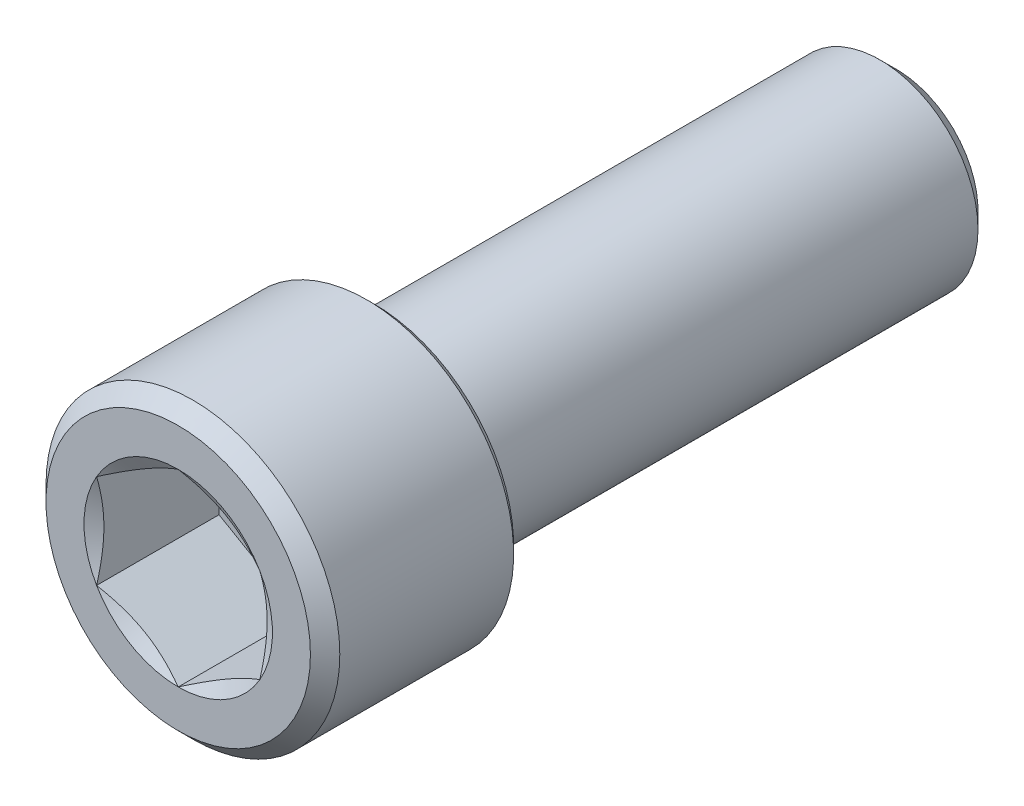
ISO-10303-21;
HEADER;
FILE_DESCRIPTION(('STEP AP214'),'2;1');
FILE_NAME('part.step','',(''),(''),'','','');
FILE_SCHEMA(('AUTOMOTIVE_DESIGN { 1 0 10303 214 1 1 1 1 }'));
ENDSEC;
DATA;
#1=APPLICATION_CONTEXT('core data for automotive mechanical design processes');
#2=APPLICATION_PROTOCOL_DEFINITION('international standard','automotive_design',2000,#1);
#3=PRODUCT_CONTEXT('',#1,'mechanical');
#4=PRODUCT('Part','Part','',(#3));
#5=PRODUCT_RELATED_PRODUCT_CATEGORY('part','',(#4));
#6=PRODUCT_DEFINITION_FORMATION('','',#4);
#7=PRODUCT_DEFINITION_CONTEXT('part definition',#1,'design');
#8=PRODUCT_DEFINITION('design','',#6,#7);
#9=PRODUCT_DEFINITION_SHAPE('','',#8);
#10=(LENGTH_UNIT() NAMED_UNIT(*) SI_UNIT(.MILLI.,.METRE.));
#11=(NAMED_UNIT(*) PLANE_ANGLE_UNIT() SI_UNIT($,.RADIAN.));
#12=(NAMED_UNIT(*) SI_UNIT($,.STERADIAN.) SOLID_ANGLE_UNIT());
#13=UNCERTAINTY_MEASURE_WITH_UNIT(LENGTH_MEASURE(1.E-05),#10,'distance_accuracy_value','');
#14=(GEOMETRIC_REPRESENTATION_CONTEXT(3) GLOBAL_UNCERTAINTY_ASSIGNED_CONTEXT((#13)) GLOBAL_UNIT_ASSIGNED_CONTEXT((#10,
#11,#12)) REPRESENTATION_CONTEXT('',''));
#15=CARTESIAN_POINT('',(0.,0.,0.));
#16=DIRECTION('',(0.,0.,1.));
#17=DIRECTION('',(1.,0.,0.));
#18=AXIS2_PLACEMENT_3D('',#15,#16,#17);
#19=CARTESIAN_POINT('',(0.,7.14375,17.4625));
#20=DIRECTION('',(0.,0.,1.));
#21=DIRECTION('',(1.,0.,0.));
#22=AXIS2_PLACEMENT_3D('',#19,#20,#21);
#23=PLANE('',#22);
#24=CARTESIAN_POINT('',(0.,0.,17.4625));
#25=DIRECTION('',(0.,0.,1.));
#26=DIRECTION('',(1.,0.,0.));
#27=AXIS2_PLACEMENT_3D('',#24,#25,#26);
#28=CIRCLE('',#27,6.429375);
#29=CARTESIAN_POINT('',(6.429375,0.,17.4625));
#30=VERTEX_POINT('',#29);
#31=EDGE_CURVE('E172',#30,#30,#28,.T.);
#32=ORIENTED_EDGE('',*,*,#31,.T.);
#33=EDGE_LOOP('',(#32));
#34=FACE_BOUND('',#33,.T.);
#35=CARTESIAN_POINT('',(0.,0.,17.4625));
#36=DIRECTION('',(0.,0.,1.));
#37=DIRECTION('',(1.,0.,0.));
#38=AXIS2_PLACEMENT_3D('',#35,#36,#37);
#39=CIRCLE('',#38,4.58271776169265);
#40=CARTESIAN_POINT('',(3.96875,2.29135888084632,17.4625));
#41=VERTEX_POINT('',#40);
#42=CARTESIAN_POINT('',(0.,4.58271776169265,17.4625));
#43=VERTEX_POINT('',#42);
#44=EDGE_CURVE('E90',#41,#43,#39,.T.);
#45=ORIENTED_EDGE('',*,*,#44,.F.);
#46=CARTESIAN_POINT('',(3.96875,-2.29135888084633,17.4625));
#47=VERTEX_POINT('',#46);
#48=EDGE_CURVE('E50',#47,#41,#39,.T.);
#49=ORIENTED_EDGE('',*,*,#48,.F.);
#50=CARTESIAN_POINT('',(0.,-4.58271776169266,17.4625));
#51=VERTEX_POINT('',#50);
#52=EDGE_CURVE('E277',#51,#47,#39,.T.);
#53=ORIENTED_EDGE('',*,*,#52,.F.);
#54=CARTESIAN_POINT('',(-3.96875,-2.29135888084633,17.4625));
#55=VERTEX_POINT('',#54);
#56=EDGE_CURVE('E57',#55,#51,#39,.T.);
#57=ORIENTED_EDGE('',*,*,#56,.F.);
#58=CARTESIAN_POINT('',(-3.96875,2.29135888084632,17.4625));
#59=VERTEX_POINT('',#58);
#60=EDGE_CURVE('E130',#59,#55,#39,.T.);
#61=ORIENTED_EDGE('',*,*,#60,.F.);
#62=EDGE_CURVE('E99',#43,#59,#39,.T.);
#63=ORIENTED_EDGE('',*,*,#62,.F.);
#64=EDGE_LOOP('',(#45,#49,#53,#57,#61,#63));
#65=FACE_BOUND('',#64,.T.);
#66=ADVANCED_FACE('F36',(#34,#65),#23,.T.);
#67=CARTESIAN_POINT('',(0.,0.,-17.4625));
#68=DIRECTION('',(0.,0.,-1.));
#69=DIRECTION('',(-1.,0.,0.));
#70=AXIS2_PLACEMENT_3D('',#67,#68,#69);
#71=CYLINDRICAL_SURFACE('',#70,7.14375);
#72=CARTESIAN_POINT('',(0.,0.,8.29468749999999));
#73=DIRECTION('',(0.,0.,-1.));
#74=DIRECTION('',(-1.,0.,0.));
#75=AXIS2_PLACEMENT_3D('',#72,#73,#74);
#76=CIRCLE('',#75,7.14375);
#77=CARTESIAN_POINT('',(-7.14375,0.,8.29468749999999));
#78=VERTEX_POINT('',#77);
#79=EDGE_CURVE('E11',#78,#78,#76,.F.);
#80=ORIENTED_EDGE('',*,*,#79,.T.);
#81=EDGE_LOOP('',(#80));
#82=FACE_BOUND('',#81,.T.);
#83=CARTESIAN_POINT('',(0.,0.,16.748125));
#84=DIRECTION('',(0.,0.,1.));
#85=DIRECTION('',(1.,0.,0.));
#86=AXIS2_PLACEMENT_3D('',#83,#84,#85);
#87=CIRCLE('',#86,7.14375);
#88=CARTESIAN_POINT('',(7.14375,0.,16.748125));
#89=VERTEX_POINT('',#88);
#90=EDGE_CURVE('E109',#89,#89,#87,.F.);
#91=ORIENTED_EDGE('',*,*,#90,.T.);
#92=EDGE_LOOP('',(#91));
#93=FACE_BOUND('',#92,.T.);
#94=ADVANCED_FACE('F189',(#82,#93),#71,.T.);
#95=CARTESIAN_POINT('',(0.,7.14375,7.9375));
#96=DIRECTION('',(0.,0.,-1.));
#97=DIRECTION('',(-1.,0.,0.));
#98=AXIS2_PLACEMENT_3D('',#95,#96,#97);
#99=PLANE('',#98);
#100=CARTESIAN_POINT('',(0.,0.,7.9375));
#101=DIRECTION('',(0.,0.,-1.));
#102=DIRECTION('',(-1.,0.,0.));
#103=AXIS2_PLACEMENT_3D('',#100,#101,#102);
#104=CIRCLE('',#103,6.7865625);
#105=CARTESIAN_POINT('',(-6.7865625,0.,7.9375));
#106=VERTEX_POINT('',#105);
#107=EDGE_CURVE('E44',#106,#106,#104,.T.);
#108=ORIENTED_EDGE('',*,*,#107,.T.);
#109=EDGE_LOOP('',(#108));
#110=FACE_BOUND('',#109,.T.);
#111=CARTESIAN_POINT('',(0.,0.,7.9375));
#112=DIRECTION('',(0.,0.,-1.));
#113=DIRECTION('',(-1.,0.,0.));
#114=AXIS2_PLACEMENT_3D('',#111,#112,#113);
#115=CIRCLE('',#114,4.7625);
#116=CARTESIAN_POINT('',(-4.7625,0.,7.9375));
#117=VERTEX_POINT('',#116);
#118=EDGE_CURVE('E110',#117,#117,#115,.T.);
#119=ORIENTED_EDGE('',*,*,#118,.F.);
#120=EDGE_LOOP('',(#119));
#121=FACE_BOUND('',#120,.T.);
#122=ADVANCED_FACE('F177',(#110,#121),#99,.T.);
#123=CARTESIAN_POINT('',(0.,0.,-17.4625));
#124=DIRECTION('',(0.,0.,-1.));
#125=DIRECTION('',(-1.,0.,0.));
#126=AXIS2_PLACEMENT_3D('',#123,#124,#125);
#127=CYLINDRICAL_SURFACE('',#126,4.7625);
#128=ORIENTED_EDGE('',*,*,#118,.T.);
#129=EDGE_LOOP('',(#128));
#130=FACE_BOUND('',#129,.T.);
#131=CARTESIAN_POINT('',(0.,0.,-16.6687499999936));
#132=DIRECTION('',(0.,0.,-1.));
#133=DIRECTION('',(-1.,0.,0.));
#134=AXIS2_PLACEMENT_3D('',#131,#132,#133);
#135=CIRCLE('',#134,4.7625);
#136=CARTESIAN_POINT('',(-4.7625,0.,-16.6687499999936));
#137=VERTEX_POINT('',#136);
#138=EDGE_CURVE('E218',#137,#137,#135,.T.);
#139=ORIENTED_EDGE('',*,*,#138,.F.);
#140=EDGE_LOOP('',(#139));
#141=FACE_BOUND('',#140,.T.);
#142=ADVANCED_FACE('F200',(#130,#141),#127,.T.);
#143=CARTESIAN_POINT('',(0.,0.,-17.4625));
#144=DIRECTION('',(0.,0.,1.));
#145=DIRECTION('',(1.,0.,0.));
#146=AXIS2_PLACEMENT_3D('',#143,#144,#145);
#147=CONICAL_SURFACE('',#146,3.96874999999365,0.785398163397443);
#148=ORIENTED_EDGE('',*,*,#138,.T.);
#149=EDGE_LOOP('',(#148));
#150=FACE_BOUND('',#149,.T.);
#151=CARTESIAN_POINT('',(0.,0.,-17.4625));
#152=DIRECTION('',(0.,0.,-1.));
#153=DIRECTION('',(-1.,0.,0.));
#154=AXIS2_PLACEMENT_3D('',#151,#152,#153);
#155=CIRCLE('',#154,3.96874999999365);
#156=CARTESIAN_POINT('',(-3.96874999999365,0.,-17.4625));
#157=VERTEX_POINT('',#156);
#158=EDGE_CURVE('E216',#157,#157,#155,.T.);
#159=ORIENTED_EDGE('',*,*,#158,.F.);
#160=EDGE_LOOP('',(#159));
#161=FACE_BOUND('',#160,.T.);
#162=ADVANCED_FACE('F203',(#150,#161),#147,.T.);
#163=CARTESIAN_POINT('',(0.,3.96874999999365,-17.4625));
#164=DIRECTION('',(0.,0.,-1.));
#165=DIRECTION('',(-1.,0.,0.));
#166=AXIS2_PLACEMENT_3D('',#163,#164,#165);
#167=PLANE('',#166);
#168=ORIENTED_EDGE('',*,*,#158,.T.);
#169=EDGE_LOOP('',(#168));
#170=FACE_BOUND('',#169,.T.);
#171=ADVANCED_FACE('F206',(#170),#167,.T.);
#172=CARTESIAN_POINT('',(0.,0.,17.4625));
#173=DIRECTION('',(0.,0.,1.));
#174=DIRECTION('',(1.,0.,0.));
#175=AXIS2_PLACEMENT_3D('',#172,#173,#174);
#176=CONICAL_SURFACE('',#175,4.58271776169265,1.0471975511966);
#177=ORIENTED_EDGE('',*,*,#62,.T.);
#178=CARTESIAN_POINT('',(0.000199999999998701,4.58283323174649,17.4625666691863));
#179=CARTESIAN_POINT('',(-0.174205902081157,4.48213993723167,17.4044101658675));
#180=CARTESIAN_POINT('',(-0.350117265982851,4.38057746392952,17.3515190334947));
#181=CARTESIAN_POINT('',(-0.704986056512739,4.17569387219009,17.2591972310558));
#182=CARTESIAN_POINT('',(-0.883949788458083,4.07236911337626,17.2197992206996));
#183=CARTESIAN_POINT('',(-1.23965934318176,3.86700010620323,17.1584707510344));
#184=CARTESIAN_POINT('',(-1.41635043707328,3.76498745558155,17.1361321137042));
#185=CARTESIAN_POINT('',(-1.7705639777928,3.56048217249652,17.1094648900063));
#186=CARTESIAN_POINT('',(-1.94808513722976,3.45799028330874,17.1051142203823));
#187=CARTESIAN_POINT('',(-2.27979074080338,3.2664799637938,17.1141671972599));
#188=CARTESIAN_POINT('',(-2.43402485076552,3.17743285888894,17.1253480315052));
#189=CARTESIAN_POINT('',(-2.74148824092523,2.99991878781428,17.1607840680674));
#190=CARTESIAN_POINT('',(-2.89471645773984,2.91145243558892,17.1850513743229));
#191=CARTESIAN_POINT('',(-3.20281373181354,2.73357239146588,17.2457175088671));
#192=CARTESIAN_POINT('',(-3.3576437962636,2.64418121207698,17.2823734880916));
#193=CARTESIAN_POINT('',(-3.66499472649982,2.46673206976942,17.3655680488882));
#194=CARTESIAN_POINT('',(-3.81751952962953,2.37867183362439,17.412087083746));
#195=CARTESIAN_POINT('',(-3.96895,2.29124341079249,17.4625666691863));
#196=B_SPLINE_CURVE_WITH_KNOTS('',3,(#178,#179,#180,#181,#182,#183,#184,#185,#186,#187,#188,
#189,#190,#191,#192,#193,#194,#195),.UNSPECIFIED.,.F.,.F.,(4,2,2,2,2,2,2,2,4),(0.,
0.629094460519772,1.25970103886327,1.87470051579827,2.48894475282133,3.02377031984306,
3.55909140824994,4.1062865060967,4.65240713705191),.UNSPECIFIED.);
#197=EDGE_CURVE('E104',#43,#59,#196,.T.);
#198=ORIENTED_EDGE('',*,*,#197,.F.);
#199=EDGE_LOOP('',(#177,#198));
#200=FACE_BOUND('',#199,.T.);
#201=ADVANCED_FACE('F105',(#200),#176,.F.);
#202=ORIENTED_EDGE('',*,*,#60,.T.);
#203=CARTESIAN_POINT('',(-3.96875,-5.93385720069013,18.9382213021848));
#204=CARTESIAN_POINT('',(-3.96875,-5.76247290518236,18.8559976024317));
#205=CARTESIAN_POINT('',(-3.96875,-5.59067109411654,18.7746279437628));
#206=CARTESIAN_POINT('',(-3.96875,-5.24600992189622,18.6140811944775));
#207=CARTESIAN_POINT('',(-3.96875,-5.07315037719824,18.534904498373));
#208=CARTESIAN_POINT('',(-3.96875,-4.72516008066855,18.378785832207));
#209=CARTESIAN_POINT('',(-3.96875,-4.55002191228936,18.3018603315239));
#210=CARTESIAN_POINT('',(-3.96875,-4.19827592516792,18.1514588596294));
#211=CARTESIAN_POINT('',(-3.96875,-4.02166818335657,18.0779827091684));
#212=CARTESIAN_POINT('',(-3.96875,-3.66204995795869,17.9335274579091));
#213=CARTESIAN_POINT('',(-3.96875,-3.47899279883904,17.8626638723423));
#214=CARTESIAN_POINT('',(-3.96875,-3.11066428213307,17.7268283656521));
#215=CARTESIAN_POINT('',(-3.96875,-2.92539267073644,17.6618571273551));
#216=CARTESIAN_POINT('',(-3.96875,-2.55276020400712,17.5396615785013));
#217=CARTESIAN_POINT('',(-3.96875,-2.36540517915988,17.4824196795427));
#218=CARTESIAN_POINT('',(-3.96875,-1.98802653725316,17.377648579222));
#219=CARTESIAN_POINT('',(-3.96875,-1.79800384013078,17.3301161134531));
#220=CARTESIAN_POINT('',(-3.96875,-1.41566112805396,17.2472893763848));
#221=CARTESIAN_POINT('',(-3.96875,-1.2233465491972,17.2119704987359));
#222=CARTESIAN_POINT('',(-3.96875,-0.836565803633968,17.155886574413));
#223=CARTESIAN_POINT('',(-3.96875,-0.642099783228199,17.1351205442315));
#224=CARTESIAN_POINT('',(-3.96875,-0.254422907076688,17.11006899599));
#225=CARTESIAN_POINT('',(-3.96875,-0.0612249296201029,17.105588996765));
#226=CARTESIAN_POINT('',(-3.96875,0.324869034019207,17.1129893123645));
#227=CARTESIAN_POINT('',(-3.96875,0.517765000762246,17.1248706402193));
#228=CARTESIAN_POINT('',(-3.96875,0.851785164132312,17.1588102076585));
#229=CARTESIAN_POINT('',(-3.96875,0.993278595467793,17.1774019241554));
#230=CARTESIAN_POINT('',(-3.96875,1.27508035581419,17.2221094232709));
#231=CARTESIAN_POINT('',(-3.96875,1.4153884907802,17.2482264141906));
#232=CARTESIAN_POINT('',(-3.96875,1.8344263078652,17.336475917239));
#233=CARTESIAN_POINT('',(-3.96875,2.11109087117279,17.4084865808457));
#234=CARTESIAN_POINT('',(-3.96875,2.52475408347748,17.5315020968605));
#235=CARTESIAN_POINT('',(-3.96875,2.66393369749918,17.5755748741826));
#236=CARTESIAN_POINT('',(-3.96875,2.94093940754497,17.6678240788877));
#237=CARTESIAN_POINT('',(-3.96875,3.07876549384498,17.7160005357285));
#238=CARTESIAN_POINT('',(-3.96875,3.35311923972777,17.8157237485943));
#239=CARTESIAN_POINT('',(-3.96875,3.48964739891177,17.8672691422408));
#240=CARTESIAN_POINT('',(-3.96875,3.76160326241629,17.9731714723231));
#241=CARTESIAN_POINT('',(-3.96875,3.89703098484502,18.0275283623856));
#242=CARTESIAN_POINT('',(-3.96875,4.24272707932808,18.1697647077135));
#243=CARTESIAN_POINT('',(-3.96875,4.45230367292839,18.2593233186035));
#244=CARTESIAN_POINT('',(-3.96875,4.86956871114983,18.4427489640076));
#245=CARTESIAN_POINT('',(-3.96875,5.07725701341209,18.536616320185));
#246=CARTESIAN_POINT('',(-3.96875,5.49114932552311,18.7276872177942));
#247=CARTESIAN_POINT('',(-3.96875,5.69735296862535,18.8248915514978));
#248=CARTESIAN_POINT('',(-3.96875,6.10851835187336,19.0218962700133));
#249=CARTESIAN_POINT('',(-3.96875,6.31348006427196,19.1216967125657));
#250=CARTESIAN_POINT('',(-3.96875,6.92733762550611,19.4243894016377));
#251=CARTESIAN_POINT('',(-3.96875,7.33472108415469,19.6303458460108));
#252=CARTESIAN_POINT('',(-3.96875,8.14669173339249,20.0475224689825));
#253=CARTESIAN_POINT('',(-3.96875,8.55127931698173,20.2587418877469));
#254=CARTESIAN_POINT('',(-3.96875,9.32042811603168,20.6647284783403));
#255=CARTESIAN_POINT('',(-3.96875,9.68516311069192,20.8591669511053));
#256=CARTESIAN_POINT('',(-3.96875,10.4134619490828,21.2502586596614));
#257=CARTESIAN_POINT('',(-3.96875,10.7770257422982,21.4469119893795));
#258=CARTESIAN_POINT('',(-3.96875,11.5023257751234,21.8413766159879));
#259=CARTESIAN_POINT('',(-3.96875,11.8640643110783,22.0391836952863));
#260=CARTESIAN_POINT('',(-3.96875,12.5868080787951,22.4360842248316));
#261=CARTESIAN_POINT('',(-3.96875,12.9478133516885,22.6351776001508));
#262=CARTESIAN_POINT('',(-3.96875,13.3085558964008,22.8347428409561));
#263=B_SPLINE_CURVE_WITH_KNOTS('',3,(#203,#204,#205,#206,#207,#208,#209,#210,#211,#212,#213,
#214,#215,#216,#217,#218,#219,#220,#221,#222,#223,#224,#225,#226,#227,#228,#229,#230,#231,#232,
#233,#234,#235,#236,#237,#238,#239,#240,#241,#242,#243,#244,#245,#246,#247,#248,#249,#250,#251,
#252,#253,#254,#255,#256,#257,#258,#259,#260,#261,#262),.UNSPECIFIED.,.F.,.F.,(4,2,2,2,2,2,2,2,
2,2,2,2,2,2,2,2,2,2,2,2,2,2,2,2,2,2,2,2,2,4),(0.,0.570271047119746,1.14064402773676,
1.71447691163811,2.28827994253684,2.87708545514649,3.46595911370704,4.05346933523151,
4.64078170375199,5.22690384231516,5.81298636587647,6.39204670485428,6.97114289862285,
7.39906029623152,7.82704644103084,8.6835554197883,9.12149757489305,9.55944287398249,
9.99721215338742,10.4349742144453,11.1186351071943,11.8023471209435,12.4862226011271,
13.1701133045062,14.5395005573573,15.9086912395109,17.1486572764944,18.388676097082,
19.6255408867118,20.862334266105),.UNSPECIFIED.);
#264=EDGE_CURVE('E98',#59,#55,#263,.F.);
#265=ORIENTED_EDGE('',*,*,#264,.F.);
#266=EDGE_LOOP('',(#202,#265));
#267=FACE_BOUND('',#266,.T.);
#268=ADVANCED_FACE('F213',(#267),#176,.F.);
#269=ORIENTED_EDGE('',*,*,#56,.T.);
#270=CARTESIAN_POINT('',(-3.96895,-2.29124341079249,17.4625666691863));
#271=CARTESIAN_POINT('',(-3.79454409791884,-2.39193670530731,17.4044101658675));
#272=CARTESIAN_POINT('',(-3.61863273401715,-2.49349917860946,17.3515190334947));
#273=CARTESIAN_POINT('',(-3.26376394348726,-2.69838277034889,17.2591972310558));
#274=CARTESIAN_POINT('',(-3.08480021154192,-2.80170752916272,17.2197992206996));
#275=CARTESIAN_POINT('',(-2.72909065681824,-3.00707653633575,17.1584707510344));
#276=CARTESIAN_POINT('',(-2.55239956292672,-3.10908918695743,17.1361321137042));
#277=CARTESIAN_POINT('',(-2.1981860222072,-3.31359447004246,17.1094648900063));
#278=CARTESIAN_POINT('',(-2.02066486277024,-3.41608635923024,17.1051142203823));
#279=CARTESIAN_POINT('',(-1.68895925919662,-3.60759667874518,17.1141671972599));
#280=CARTESIAN_POINT('',(-1.53472514923448,-3.69664378365004,17.1253480315052));
#281=CARTESIAN_POINT('',(-1.22726175907477,-3.8741578547247,17.1607840680674));
#282=CARTESIAN_POINT('',(-1.07403354226016,-3.96262420695006,17.1850513743229));
#283=CARTESIAN_POINT('',(-0.765936268186464,-4.1405042510731,17.2457175088671));
#284=CARTESIAN_POINT('',(-0.611106203736396,-4.229895430462,17.2823734880916));
#285=CARTESIAN_POINT('',(-0.303755273500178,-4.40734457276956,17.3655680488882));
#286=CARTESIAN_POINT('',(-0.15123047037047,-4.49540480891459,17.412087083746));
#287=CARTESIAN_POINT('',(0.000200000000002123,-4.58283323174649,17.4625666691863));
#288=B_SPLINE_CURVE_WITH_KNOTS('',3,(#270,#271,#272,#273,#274,#275,#276,#277,#278,#279,#280,
#281,#282,#283,#284,#285,#286,#287),.UNSPECIFIED.,.F.,.F.,(4,2,2,2,2,2,2,2,4),(0.,
0.629094460519773,1.25970103886327,1.87470051579826,2.48894475282133,3.02377031984306,
3.55909140824994,4.1062865060967,4.65240713705191),.UNSPECIFIED.);
#289=EDGE_CURVE('E140',#55,#51,#288,.T.);
#290=ORIENTED_EDGE('',*,*,#289,.F.);
#291=EDGE_LOOP('',(#269,#290));
#292=FACE_BOUND('',#291,.T.);
#293=ADVANCED_FACE('F280',(#292),#176,.F.);
#294=ORIENTED_EDGE('',*,*,#52,.T.);
#295=CARTESIAN_POINT('',(-0.00019999999999802,-4.58283323174649,17.4625666691863));
#296=CARTESIAN_POINT('',(0.174205902081159,-4.48213993723168,17.4044101658675));
#297=CARTESIAN_POINT('',(0.350117265982853,-4.38057746392952,17.3515190334947));
#298=CARTESIAN_POINT('',(0.70498605651274,-4.17569387219009,17.2591972310558));
#299=CARTESIAN_POINT('',(0.883949788458084,-4.07236911337627,17.2197992206996));
#300=CARTESIAN_POINT('',(1.23965934318176,-3.86700010620323,17.1584707510344));
#301=CARTESIAN_POINT('',(1.41635043707328,-3.76498745558155,17.1361321137042));
#302=CARTESIAN_POINT('',(1.7705639777928,-3.56048217249653,17.1094648900063));
#303=CARTESIAN_POINT('',(1.94808513722976,-3.45799028330875,17.1051142203823));
#304=CARTESIAN_POINT('',(2.27979074080338,-3.26647996379381,17.1141671972599));
#305=CARTESIAN_POINT('',(2.43402485076552,-3.17743285888894,17.1253480315052));
#306=CARTESIAN_POINT('',(2.74148824092523,-2.99991878781428,17.1607840680674));
#307=CARTESIAN_POINT('',(2.89471645773984,-2.91145243558892,17.1850513743229));
#308=CARTESIAN_POINT('',(3.20281373181354,-2.73357239146588,17.2457175088671));
#309=CARTESIAN_POINT('',(3.3576437962636,-2.64418121207699,17.2823734880916));
#310=CARTESIAN_POINT('',(3.66499472649982,-2.46673206976942,17.3655680488882));
#311=CARTESIAN_POINT('',(3.81751952962953,-2.37867183362439,17.412087083746));
#312=CARTESIAN_POINT('',(3.96895,-2.29124341079249,17.4625666691863));
#313=B_SPLINE_CURVE_WITH_KNOTS('',3,(#295,#296,#297,#298,#299,#300,#301,#302,#303,#304,#305,
#306,#307,#308,#309,#310,#311,#312),.UNSPECIFIED.,.F.,.F.,(4,2,2,2,2,2,2,2,4),(0.,
0.629094460519773,1.25970103886327,1.87470051579826,2.48894475282133,3.02377031984306,
3.55909140824994,4.1062865060967,4.6524071370519),.UNSPECIFIED.);
#314=EDGE_CURVE('E254',#51,#47,#313,.T.);
#315=ORIENTED_EDGE('',*,*,#314,.F.);
#316=EDGE_LOOP('',(#294,#315));
#317=FACE_BOUND('',#316,.T.);
#318=ADVANCED_FACE('F279',(#317),#176,.F.);
#319=ORIENTED_EDGE('',*,*,#48,.T.);
#320=CARTESIAN_POINT('',(3.96875,-5.93385720069013,18.9382213021848));
#321=CARTESIAN_POINT('',(3.96875,-5.76247290518236,18.8559976024317));
#322=CARTESIAN_POINT('',(3.96875,-5.59067109411654,18.7746279437628));
#323=CARTESIAN_POINT('',(3.96875,-5.24600992189622,18.6140811944775));
#324=CARTESIAN_POINT('',(3.96875,-5.07315037719825,18.534904498373));
#325=CARTESIAN_POINT('',(3.96875,-4.72516008066855,18.378785832207));
#326=CARTESIAN_POINT('',(3.96875,-4.55002191228936,18.3018603315239));
#327=CARTESIAN_POINT('',(3.96875,-4.19827592516792,18.1514588596294));
#328=CARTESIAN_POINT('',(3.96875,-4.02166818335657,18.0779827091684));
#329=CARTESIAN_POINT('',(3.96875,-3.66204995795869,17.9335274579091));
#330=CARTESIAN_POINT('',(3.96875,-3.47899279883904,17.8626638723423));
#331=CARTESIAN_POINT('',(3.96875,-3.11066428213306,17.7268283656521));
#332=CARTESIAN_POINT('',(3.96875,-2.92539267073644,17.6618571273551));
#333=CARTESIAN_POINT('',(3.96875,-2.55276020400712,17.5396615785013));
#334=CARTESIAN_POINT('',(3.96875,-2.36540517915988,17.4824196795427));
#335=CARTESIAN_POINT('',(3.96875,-1.98802653725315,17.377648579222));
#336=CARTESIAN_POINT('',(3.96875,-1.79800384013077,17.3301161134531));
#337=CARTESIAN_POINT('',(3.96875,-1.41566112805396,17.2472893763848));
#338=CARTESIAN_POINT('',(3.96875,-1.2233465491972,17.2119704987359));
#339=CARTESIAN_POINT('',(3.96875,-0.836565803633966,17.155886574413));
#340=CARTESIAN_POINT('',(3.96875,-0.642099783228196,17.1351205442315));
#341=CARTESIAN_POINT('',(3.96875,-0.254422907076686,17.11006899599));
#342=CARTESIAN_POINT('',(3.96875,-0.0612249296201008,17.105588996765));
#343=CARTESIAN_POINT('',(3.96875,0.324869034019209,17.1129893123645));
#344=CARTESIAN_POINT('',(3.96875,0.517765000762247,17.1248706402193));
#345=CARTESIAN_POINT('',(3.96875,0.851785164132313,17.1588102076585));
#346=CARTESIAN_POINT('',(3.96875,0.993278595467794,17.1774019241554));
#347=CARTESIAN_POINT('',(3.96875,1.27508035581419,17.2221094232709));
#348=CARTESIAN_POINT('',(3.96875,1.4153884907802,17.2482264141906));
#349=CARTESIAN_POINT('',(3.96875,1.8344263078652,17.336475917239));
#350=CARTESIAN_POINT('',(3.96875,2.11109087117279,17.4084865808457));
#351=CARTESIAN_POINT('',(3.96875,2.52475408347748,17.5315020968605));
#352=CARTESIAN_POINT('',(3.96875,2.66393369749918,17.5755748741826));
#353=CARTESIAN_POINT('',(3.96875,2.94093940754497,17.6678240788877));
#354=CARTESIAN_POINT('',(3.96875,3.07876549384498,17.7160005357285));
#355=CARTESIAN_POINT('',(3.96875,3.35311923972778,17.8157237485943));
#356=CARTESIAN_POINT('',(3.96875,3.48964739891177,17.8672691422408));
#357=CARTESIAN_POINT('',(3.96875,3.76160326241629,17.9731714723231));
#358=CARTESIAN_POINT('',(3.96875,3.89703098484502,18.0275283623856));
#359=CARTESIAN_POINT('',(3.96875,4.24272707932808,18.1697647077135));
#360=CARTESIAN_POINT('',(3.96875,4.45230367292839,18.2593233186035));
#361=CARTESIAN_POINT('',(3.96875,4.86956871114983,18.4427489640076));
#362=CARTESIAN_POINT('',(3.96875,5.0772570134121,18.536616320185));
#363=CARTESIAN_POINT('',(3.96875,5.49114932552311,18.7276872177943));
#364=CARTESIAN_POINT('',(3.96875,5.69735296862535,18.8248915514978));
#365=CARTESIAN_POINT('',(3.96875,6.10851835187336,19.0218962700133));
#366=CARTESIAN_POINT('',(3.96875,6.31348006427197,19.1216967125657));
#367=CARTESIAN_POINT('',(3.96875,6.92733762550612,19.4243894016377));
#368=CARTESIAN_POINT('',(3.96875,7.33472108415469,19.6303458460108));
#369=CARTESIAN_POINT('',(3.96875,8.14669173339249,20.0475224689825));
#370=CARTESIAN_POINT('',(3.96875,8.55127931698174,20.2587418877469));
#371=CARTESIAN_POINT('',(3.96875,9.32042811603168,20.6647284783403));
#372=CARTESIAN_POINT('',(3.96875,9.68516311069192,20.8591669511053));
#373=CARTESIAN_POINT('',(3.96875,10.4134619490828,21.2502586596614));
#374=CARTESIAN_POINT('',(3.96875,10.7770257422982,21.4469119893795));
#375=CARTESIAN_POINT('',(3.96875,11.5023257751234,21.8413766159879));
#376=CARTESIAN_POINT('',(3.96875,11.8640643110783,22.0391836952863));
#377=CARTESIAN_POINT('',(3.96875,12.5868080787951,22.4360842248316));
#378=CARTESIAN_POINT('',(3.96875,12.9478133516885,22.6351776001508));
#379=CARTESIAN_POINT('',(3.96875,13.3085558964008,22.8347428409561));
#380=B_SPLINE_CURVE_WITH_KNOTS('',3,(#320,#321,#322,#323,#324,#325,#326,#327,#328,#329,#330,
#331,#332,#333,#334,#335,#336,#337,#338,#339,#340,#341,#342,#343,#344,#345,#346,#347,#348,#349,
#350,#351,#352,#353,#354,#355,#356,#357,#358,#359,#360,#361,#362,#363,#364,#365,#366,#367,#368,
#369,#370,#371,#372,#373,#374,#375,#376,#377,#378,#379),.UNSPECIFIED.,.F.,.F.,(4,2,2,2,2,2,2,2,
2,2,2,2,2,2,2,2,2,2,2,2,2,2,2,2,2,2,2,2,2,4),(0.,0.570271047119744,1.14064402773676,
1.7144769116381,2.28827994253684,2.87708545514649,3.46595911370705,4.05346933523151,
4.64078170375199,5.22690384231516,5.81298636587647,6.39204670485428,6.97114289862285,
7.39906029623152,7.82704644103084,8.6835554197883,9.12149757489305,9.55944287398249,
9.99721215338742,10.4349742144453,11.1186351071943,11.8023471209435,12.4862226011271,
13.1701133045062,14.5395005573573,15.9086912395109,17.1486572764944,18.388676097082,
19.6255408867118,20.862334266105),.UNSPECIFIED.);
#381=EDGE_CURVE('E120',#47,#41,#380,.T.);
#382=ORIENTED_EDGE('',*,*,#381,.F.);
#383=EDGE_LOOP('',(#319,#382));
#384=FACE_BOUND('',#383,.T.);
#385=ADVANCED_FACE('F290',(#384),#176,.F.);
#386=ORIENTED_EDGE('',*,*,#44,.T.);
#387=CARTESIAN_POINT('',(3.96895,2.29124341079249,17.4625666691863));
#388=CARTESIAN_POINT('',(3.79454409791884,2.3919367053073,17.4044101658675));
#389=CARTESIAN_POINT('',(3.61863273401715,2.49349917860946,17.3515190334947));
#390=CARTESIAN_POINT('',(3.26376394348726,2.69838277034889,17.2591972310558));
#391=CARTESIAN_POINT('',(3.08480021154192,2.80170752916271,17.2197992206996));
#392=CARTESIAN_POINT('',(2.72909065681824,3.00707653633575,17.1584707510344));
#393=CARTESIAN_POINT('',(2.55239956292672,3.10908918695743,17.1361321137042));
#394=CARTESIAN_POINT('',(2.1981860222072,3.31359447004245,17.1094648900063));
#395=CARTESIAN_POINT('',(2.02066486277024,3.41608635923023,17.1051142203823));
#396=CARTESIAN_POINT('',(1.68895925919662,3.60759667874517,17.1141671972599));
#397=CARTESIAN_POINT('',(1.53472514923448,3.69664378365004,17.1253480315052));
#398=CARTESIAN_POINT('',(1.22726175907477,3.8741578547247,17.1607840680674));
#399=CARTESIAN_POINT('',(1.07403354226016,3.96262420695006,17.1850513743229));
#400=CARTESIAN_POINT('',(0.765936268186463,4.1405042510731,17.2457175088671));
#401=CARTESIAN_POINT('',(0.611106203736395,4.22989543046199,17.2823734880916));
#402=CARTESIAN_POINT('',(0.303755273500176,4.40734457276956,17.3655680488882));
#403=CARTESIAN_POINT('',(0.151230470370469,4.49540480891459,17.412087083746));
#404=CARTESIAN_POINT('',(-0.000200000000002257,4.58283323174649,17.4625666691863));
#405=B_SPLINE_CURVE_WITH_KNOTS('',3,(#387,#388,#389,#390,#391,#392,#393,#394,#395,#396,#397,
#398,#399,#400,#401,#402,#403,#404),.UNSPECIFIED.,.F.,.F.,(4,2,2,2,2,2,2,2,4),(0.,
0.629094460519772,1.25970103886327,1.87470051579827,2.48894475282133,3.02377031984306,
3.55909140824994,4.1062865060967,4.65240713705191),.UNSPECIFIED.);
#406=EDGE_CURVE('E94',#41,#43,#405,.T.);
#407=ORIENTED_EDGE('',*,*,#406,.F.);
#408=EDGE_LOOP('',(#386,#407));
#409=FACE_BOUND('',#408,.T.);
#410=ADVANCED_FACE('F92',(#409),#176,.F.);
#411=CARTESIAN_POINT('',(0.,0.,11.509375));
#412=DIRECTION('',(0.,0.,1.));
#413=DIRECTION('',(1.,0.,0.));
#414=AXIS2_PLACEMENT_3D('',#411,#412,#413);
#415=PLANE('',#414);
#416=DIRECTION('',(-0.866025403784439,0.5,0.));
#417=VECTOR('',#416,1.);
#418=CARTESIAN_POINT('',(3.96875,2.29135888084633,11.509375));
#419=LINE('',#418,#417);
#420=CARTESIAN_POINT('',(3.96875,2.29135888084633,11.509375));
#421=VERTEX_POINT('',#420);
#422=CARTESIAN_POINT('',(0.,4.58271776169265,11.509375));
#423=VERTEX_POINT('',#422);
#424=EDGE_CURVE('E119',#421,#423,#419,.T.);
#425=ORIENTED_EDGE('',*,*,#424,.T.);
#426=DIRECTION('',(-0.866025403784438,-0.5,0.));
#427=VECTOR('',#426,1.);
#428=CARTESIAN_POINT('',(0.,4.58271776169265,11.509375));
#429=LINE('',#428,#427);
#430=CARTESIAN_POINT('',(-3.96875,2.29135888084632,11.509375));
#431=VERTEX_POINT('',#430);
#432=EDGE_CURVE('E124',#423,#431,#429,.T.);
#433=ORIENTED_EDGE('',*,*,#432,.T.);
#434=DIRECTION('',(0.,-1.,0.));
#435=VECTOR('',#434,1.);
#436=CARTESIAN_POINT('',(-3.96875,2.29135888084632,11.509375));
#437=LINE('',#436,#435);
#438=CARTESIAN_POINT('',(-3.96875,-2.29135888084633,11.509375));
#439=VERTEX_POINT('',#438);
#440=EDGE_CURVE('E240',#431,#439,#437,.T.);
#441=ORIENTED_EDGE('',*,*,#440,.T.);
#442=DIRECTION('',(0.866025403784439,-0.5,0.));
#443=VECTOR('',#442,1.);
#444=CARTESIAN_POINT('',(-3.96875,-2.29135888084633,11.509375));
#445=LINE('',#444,#443);
#446=CARTESIAN_POINT('',(0.,-4.58271776169266,11.509375));
#447=VERTEX_POINT('',#446);
#448=EDGE_CURVE('E237',#439,#447,#445,.T.);
#449=ORIENTED_EDGE('',*,*,#448,.T.);
#450=DIRECTION('',(0.866025403784439,0.5,0.));
#451=VECTOR('',#450,1.);
#452=CARTESIAN_POINT('',(0.,-4.58271776169266,11.509375));
#453=LINE('',#452,#451);
#454=CARTESIAN_POINT('',(3.96875,-2.29135888084633,11.509375));
#455=VERTEX_POINT('',#454);
#456=EDGE_CURVE('E234',#447,#455,#453,.T.);
#457=ORIENTED_EDGE('',*,*,#456,.T.);
#458=DIRECTION('',(0.,1.,0.));
#459=VECTOR('',#458,1.);
#460=CARTESIAN_POINT('',(3.96875,-2.29135888084633,11.509375));
#461=LINE('',#460,#459);
#462=EDGE_CURVE('E127',#455,#421,#461,.T.);
#463=ORIENTED_EDGE('',*,*,#462,.T.);
#464=EDGE_LOOP('',(#425,#433,#441,#449,#457,#463));
#465=FACE_BOUND('',#464,.T.);
#466=ADVANCED_FACE('F160',(#465),#415,.T.);
#467=CARTESIAN_POINT('',(0.,4.58271776169265,11.509375));
#468=DIRECTION('',(-0.5,0.866025403784438,0.));
#469=DIRECTION('',(-0.866025403784438,-0.5,0.));
#470=AXIS2_PLACEMENT_3D('',#467,#468,#469);
#471=PLANE('',#470);
#472=DIRECTION('',(0.,0.,1.));
#473=VECTOR('',#472,1.);
#474=CARTESIAN_POINT('',(0.,4.58271776169265,11.509375));
#475=LINE('',#474,#473);
#476=EDGE_CURVE('E116',#423,#43,#475,.T.);
#477=ORIENTED_EDGE('',*,*,#476,.T.);
#478=ORIENTED_EDGE('',*,*,#197,.T.);
#479=DIRECTION('',(0.,0.,1.));
#480=VECTOR('',#479,1.);
#481=CARTESIAN_POINT('',(-3.96875,2.29135888084632,11.509375));
#482=LINE('',#481,#480);
#483=EDGE_CURVE('E126',#431,#59,#482,.T.);
#484=ORIENTED_EDGE('',*,*,#483,.F.);
#485=ORIENTED_EDGE('',*,*,#432,.F.);
#486=EDGE_LOOP('',(#477,#478,#484,#485));
#487=FACE_BOUND('',#486,.T.);
#488=ADVANCED_FACE('F122',(#487),#471,.F.);
#489=CARTESIAN_POINT('',(-3.96875,2.29135888084632,11.509375));
#490=DIRECTION('',(-1.,0.,0.));
#491=DIRECTION('',(0.,-1.,0.));
#492=AXIS2_PLACEMENT_3D('',#489,#490,#491);
#493=PLANE('',#492);
#494=ORIENTED_EDGE('',*,*,#483,.T.);
#495=ORIENTED_EDGE('',*,*,#264,.T.);
#496=DIRECTION('',(0.,0.,1.));
#497=VECTOR('',#496,1.);
#498=CARTESIAN_POINT('',(-3.96875,-2.29135888084633,11.509375));
#499=LINE('',#498,#497);
#500=EDGE_CURVE('E225',#439,#55,#499,.T.);
#501=ORIENTED_EDGE('',*,*,#500,.F.);
#502=ORIENTED_EDGE('',*,*,#440,.F.);
#503=EDGE_LOOP('',(#494,#495,#501,#502));
#504=FACE_BOUND('',#503,.T.);
#505=ADVANCED_FACE('F149',(#504),#493,.F.);
#506=CARTESIAN_POINT('',(-3.96875,-2.29135888084633,11.509375));
#507=DIRECTION('',(-0.5,-0.866025403784439,0.));
#508=DIRECTION('',(0.866025403784439,-0.5,0.));
#509=AXIS2_PLACEMENT_3D('',#506,#507,#508);
#510=PLANE('',#509);
#511=ORIENTED_EDGE('',*,*,#500,.T.);
#512=ORIENTED_EDGE('',*,*,#289,.T.);
#513=DIRECTION('',(0.,0.,1.));
#514=VECTOR('',#513,1.);
#515=CARTESIAN_POINT('',(0.,-4.58271776169266,11.509375));
#516=LINE('',#515,#514);
#517=EDGE_CURVE('E228',#447,#51,#516,.T.);
#518=ORIENTED_EDGE('',*,*,#517,.F.);
#519=ORIENTED_EDGE('',*,*,#448,.F.);
#520=EDGE_LOOP('',(#511,#512,#518,#519));
#521=FACE_BOUND('',#520,.T.);
#522=ADVANCED_FACE('F153',(#521),#510,.F.);
#523=CARTESIAN_POINT('',(0.,-4.58271776169266,11.509375));
#524=DIRECTION('',(0.5,-0.866025403784439,0.));
#525=DIRECTION('',(0.866025403784439,0.5,0.));
#526=AXIS2_PLACEMENT_3D('',#523,#524,#525);
#527=PLANE('',#526);
#528=ORIENTED_EDGE('',*,*,#517,.T.);
#529=ORIENTED_EDGE('',*,*,#314,.T.);
#530=DIRECTION('',(0.,0.,1.));
#531=VECTOR('',#530,1.);
#532=CARTESIAN_POINT('',(3.96875,-2.29135888084633,11.509375));
#533=LINE('',#532,#531);
#534=EDGE_CURVE('E221',#455,#47,#533,.T.);
#535=ORIENTED_EDGE('',*,*,#534,.F.);
#536=ORIENTED_EDGE('',*,*,#456,.F.);
#537=EDGE_LOOP('',(#528,#529,#535,#536));
#538=FACE_BOUND('',#537,.T.);
#539=ADVANCED_FACE('F262',(#538),#527,.F.);
#540=CARTESIAN_POINT('',(3.96875,-2.29135888084633,11.509375));
#541=DIRECTION('',(1.,0.,0.));
#542=DIRECTION('',(0.,0.,-1.));
#543=AXIS2_PLACEMENT_3D('',#540,#541,#542);
#544=PLANE('',#543);
#545=ORIENTED_EDGE('',*,*,#534,.T.);
#546=ORIENTED_EDGE('',*,*,#381,.T.);
#547=DIRECTION('',(0.,0.,1.));
#548=VECTOR('',#547,1.);
#549=CARTESIAN_POINT('',(3.96875,2.29135888084633,11.509375));
#550=LINE('',#549,#548);
#551=EDGE_CURVE('E118',#421,#41,#550,.T.);
#552=ORIENTED_EDGE('',*,*,#551,.F.);
#553=ORIENTED_EDGE('',*,*,#462,.F.);
#554=EDGE_LOOP('',(#545,#546,#552,#553));
#555=FACE_BOUND('',#554,.T.);
#556=ADVANCED_FACE('F259',(#555),#544,.F.);
#557=CARTESIAN_POINT('',(3.96875,2.29135888084633,11.509375));
#558=DIRECTION('',(0.5,0.866025403784439,0.));
#559=DIRECTION('',(-0.866025403784439,0.5,0.));
#560=AXIS2_PLACEMENT_3D('',#557,#558,#559);
#561=PLANE('',#560);
#562=ORIENTED_EDGE('',*,*,#551,.T.);
#563=ORIENTED_EDGE('',*,*,#406,.T.);
#564=ORIENTED_EDGE('',*,*,#476,.F.);
#565=ORIENTED_EDGE('',*,*,#424,.F.);
#566=EDGE_LOOP('',(#562,#563,#564,#565));
#567=FACE_BOUND('',#566,.T.);
#568=ADVANCED_FACE('F114',(#567),#561,.F.);
#569=CARTESIAN_POINT('',(0.,0.,16.748125));
#570=DIRECTION('',(0.,0.,-1.));
#571=DIRECTION('',(-1.,0.,0.));
#572=AXIS2_PLACEMENT_3D('',#569,#570,#571);
#573=CONICAL_SURFACE('',#572,7.14375,0.785398163397451);
#574=ORIENTED_EDGE('',*,*,#31,.F.);
#575=EDGE_LOOP('',(#574));
#576=FACE_BOUND('',#575,.T.);
#577=ORIENTED_EDGE('',*,*,#90,.F.);
#578=EDGE_LOOP('',(#577));
#579=FACE_BOUND('',#578,.T.);
#580=ADVANCED_FACE('F181',(#576,#579),#573,.T.);
#581=CARTESIAN_POINT('',(0.,0.,7.9375));
#582=DIRECTION('',(0.,0.,1.));
#583=DIRECTION('',(1.,0.,0.));
#584=AXIS2_PLACEMENT_3D('',#581,#582,#583);
#585=CONICAL_SURFACE('',#584,6.7865625,0.785398163397454);
#586=ORIENTED_EDGE('',*,*,#79,.F.);
#587=EDGE_LOOP('',(#586));
#588=FACE_BOUND('',#587,.T.);
#589=ORIENTED_EDGE('',*,*,#107,.F.);
#590=EDGE_LOOP('',(#589));
#591=FACE_BOUND('',#590,.T.);
#592=ADVANCED_FACE('F38',(#588,#591),#585,.T.);
#593=CLOSED_SHELL('',(#66,#94,#122,#142,#162,#171,#201,#268,#293,#318,#385,#410,#466,#488,#505,
#522,#539,#556,#568,#580,#592));
#594=MANIFOLD_SOLID_BREP('B2',#593);
#595=ADVANCED_BREP_SHAPE_REPRESENTATION('',(#18,#594),#14);
#596=SHAPE_DEFINITION_REPRESENTATION(#9,#595);
ENDSEC;
END-ISO-10303-21;
